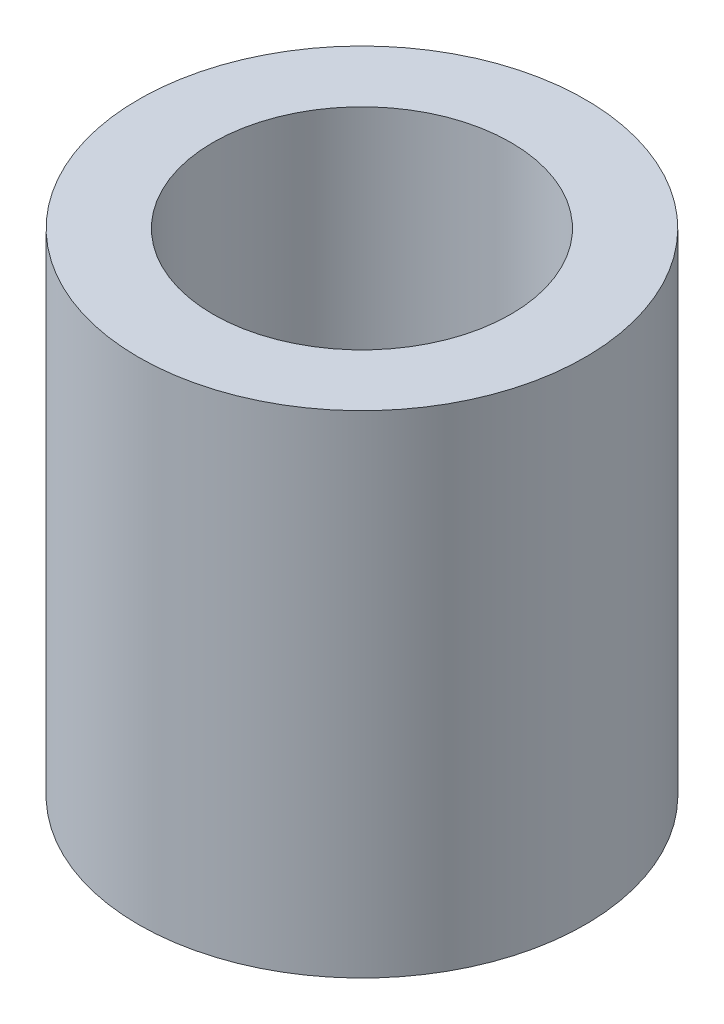
ISO-10303-21;
HEADER;
FILE_DESCRIPTION(('STEP AP214'),'2;1');
FILE_NAME('part.step','',(''),(''),'','','');
FILE_SCHEMA(('AUTOMOTIVE_DESIGN { 1 0 10303 214 1 1 1 1 }'));
ENDSEC;
DATA;
#1=APPLICATION_CONTEXT('core data for automotive mechanical design processes');
#2=APPLICATION_PROTOCOL_DEFINITION('international standard','automotive_design',2000,#1);
#3=PRODUCT_CONTEXT('',#1,'mechanical');
#4=PRODUCT('Part','Part','',(#3));
#5=PRODUCT_RELATED_PRODUCT_CATEGORY('part','',(#4));
#6=PRODUCT_DEFINITION_FORMATION('','',#4);
#7=PRODUCT_DEFINITION_CONTEXT('part definition',#1,'design');
#8=PRODUCT_DEFINITION('design','',#6,#7);
#9=PRODUCT_DEFINITION_SHAPE('','',#8);
#10=(LENGTH_UNIT() NAMED_UNIT(*) SI_UNIT(.MILLI.,.METRE.));
#11=(NAMED_UNIT(*) PLANE_ANGLE_UNIT() SI_UNIT($,.RADIAN.));
#12=(NAMED_UNIT(*) SI_UNIT($,.STERADIAN.) SOLID_ANGLE_UNIT());
#13=UNCERTAINTY_MEASURE_WITH_UNIT(LENGTH_MEASURE(1.E-05),#10,'distance_accuracy_value','');
#14=(GEOMETRIC_REPRESENTATION_CONTEXT(3) GLOBAL_UNCERTAINTY_ASSIGNED_CONTEXT((#13)) GLOBAL_UNIT_ASSIGNED_CONTEXT((#10,
#11,#12)) REPRESENTATION_CONTEXT('',''));
#15=CARTESIAN_POINT('',(0.,0.,0.));
#16=DIRECTION('',(0.,0.,1.));
#17=DIRECTION('',(1.,0.,0.));
#18=AXIS2_PLACEMENT_3D('',#15,#16,#17);
#19=CARTESIAN_POINT('',(0.,20.955,0.));
#20=DIRECTION('',(0.,-1.,0.));
#21=DIRECTION('',(0.,0.,-1.));
#22=AXIS2_PLACEMENT_3D('',#19,#20,#21);
#23=CYLINDRICAL_SURFACE('',#22,6.35);
#24=CARTESIAN_POINT('',(0.,20.955,0.));
#25=DIRECTION('',(0.,1.,0.));
#26=DIRECTION('',(0.,0.,1.));
#27=AXIS2_PLACEMENT_3D('',#24,#25,#26);
#28=CIRCLE('',#27,6.35);
#29=CARTESIAN_POINT('',(0.,20.955,6.35));
#30=VERTEX_POINT('',#29);
#31=EDGE_CURVE('E48',#30,#30,#28,.T.);
#32=ORIENTED_EDGE('',*,*,#31,.T.);
#33=EDGE_LOOP('',(#32));
#34=FACE_BOUND('',#33,.T.);
#35=CARTESIAN_POINT('',(0.,0.,0.));
#36=DIRECTION('',(0.,1.,0.));
#37=DIRECTION('',(0.,0.,1.));
#38=AXIS2_PLACEMENT_3D('',#35,#36,#37);
#39=CIRCLE('',#38,6.35);
#40=CARTESIAN_POINT('',(0.,0.,6.35));
#41=VERTEX_POINT('',#40);
#42=EDGE_CURVE('E54',#41,#41,#39,.T.);
#43=ORIENTED_EDGE('',*,*,#42,.F.);
#44=EDGE_LOOP('',(#43));
#45=FACE_BOUND('',#44,.T.);
#46=ADVANCED_FACE('F41',(#34,#45),#23,.F.);
#47=CARTESIAN_POINT('',(0.,20.955,0.));
#48=DIRECTION('',(0.,-1.,0.));
#49=DIRECTION('',(0.,0.,-1.));
#50=AXIS2_PLACEMENT_3D('',#47,#48,#49);
#51=CYLINDRICAL_SURFACE('',#50,9.525);
#52=CARTESIAN_POINT('',(0.,20.955,0.));
#53=DIRECTION('',(0.,1.,0.));
#54=DIRECTION('',(0.,0.,1.));
#55=AXIS2_PLACEMENT_3D('',#52,#53,#54);
#56=CIRCLE('',#55,9.525);
#57=CARTESIAN_POINT('',(0.,20.955,9.525));
#58=VERTEX_POINT('',#57);
#59=EDGE_CURVE('E10',#58,#58,#56,.T.);
#60=ORIENTED_EDGE('',*,*,#59,.F.);
#61=EDGE_LOOP('',(#60));
#62=FACE_BOUND('',#61,.T.);
#63=CARTESIAN_POINT('',(0.,0.,0.));
#64=DIRECTION('',(0.,1.,0.));
#65=DIRECTION('',(0.,0.,1.));
#66=AXIS2_PLACEMENT_3D('',#63,#64,#65);
#67=CIRCLE('',#66,9.525);
#68=CARTESIAN_POINT('',(0.,0.,9.525));
#69=VERTEX_POINT('',#68);
#70=EDGE_CURVE('E44',#69,#69,#67,.T.);
#71=ORIENTED_EDGE('',*,*,#70,.T.);
#72=EDGE_LOOP('',(#71));
#73=FACE_BOUND('',#72,.T.);
#74=ADVANCED_FACE('F61',(#62,#73),#51,.T.);
#75=CARTESIAN_POINT('',(0.,20.955,0.));
#76=DIRECTION('',(0.,1.,0.));
#77=DIRECTION('',(0.,0.,1.));
#78=AXIS2_PLACEMENT_3D('',#75,#76,#77);
#79=PLANE('',#78);
#80=ORIENTED_EDGE('',*,*,#31,.F.);
#81=EDGE_LOOP('',(#80));
#82=FACE_BOUND('',#81,.T.);
#83=ORIENTED_EDGE('',*,*,#59,.T.);
#84=EDGE_LOOP('',(#83));
#85=FACE_BOUND('',#84,.T.);
#86=ADVANCED_FACE('F65',(#82,#85),#79,.T.);
#87=CARTESIAN_POINT('',(0.,0.,0.));
#88=DIRECTION('',(0.,1.,0.));
#89=DIRECTION('',(0.,0.,1.));
#90=AXIS2_PLACEMENT_3D('',#87,#88,#89);
#91=PLANE('',#90);
#92=ORIENTED_EDGE('',*,*,#42,.T.);
#93=EDGE_LOOP('',(#92));
#94=FACE_BOUND('',#93,.T.);
#95=ORIENTED_EDGE('',*,*,#70,.F.);
#96=EDGE_LOOP('',(#95));
#97=FACE_BOUND('',#96,.T.);
#98=ADVANCED_FACE('F63',(#94,#97),#91,.F.);
#99=CLOSED_SHELL('',(#46,#74,#86,#98));
#100=MANIFOLD_SOLID_BREP('B2',#99);
#101=ADVANCED_BREP_SHAPE_REPRESENTATION('',(#18,#100),#14);
#102=SHAPE_DEFINITION_REPRESENTATION(#9,#101);
ENDSEC;
END-ISO-10303-21;
